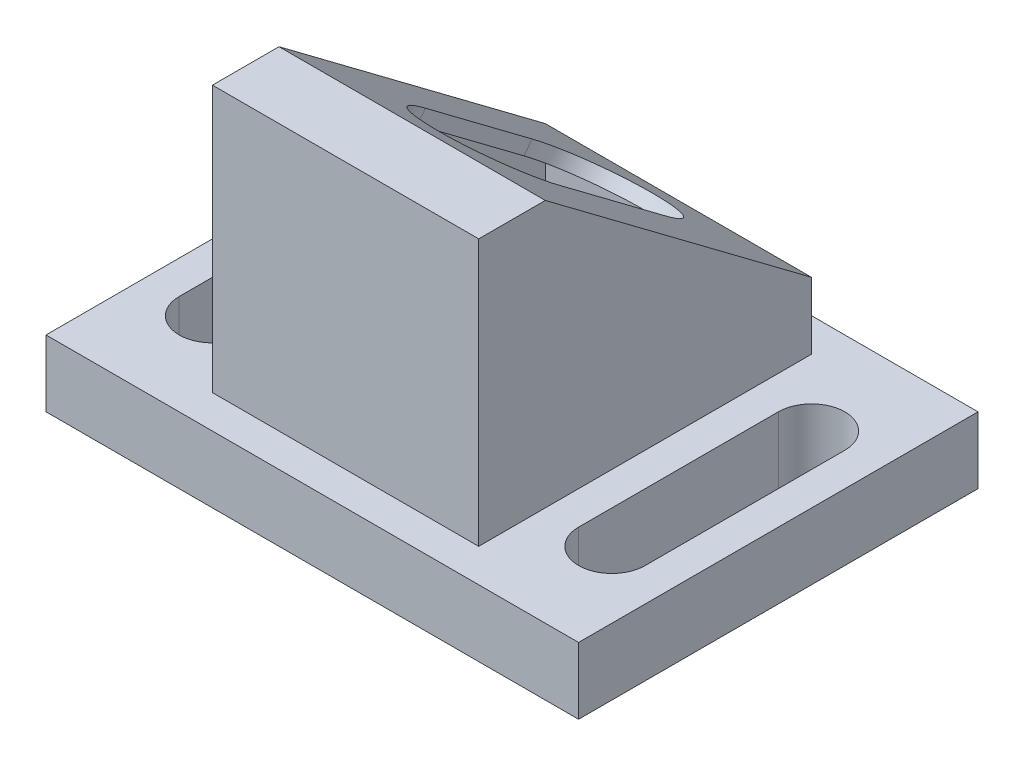
ISO-10303-21;
HEADER;
FILE_DESCRIPTION(('STEP AP214'),'2;1');
FILE_NAME('part.step','',(''),(''),'','','');
FILE_SCHEMA(('AUTOMOTIVE_DESIGN { 1 0 10303 214 1 1 1 1 }'));
ENDSEC;
DATA;
#1=APPLICATION_CONTEXT('core data for automotive mechanical design processes');
#2=APPLICATION_PROTOCOL_DEFINITION('international standard','automotive_design',2000,#1);
#3=PRODUCT_CONTEXT('',#1,'mechanical');
#4=PRODUCT('Part','Part','',(#3));
#5=PRODUCT_RELATED_PRODUCT_CATEGORY('part','',(#4));
#6=PRODUCT_DEFINITION_FORMATION('','',#4);
#7=PRODUCT_DEFINITION_CONTEXT('part definition',#1,'design');
#8=PRODUCT_DEFINITION('design','',#6,#7);
#9=PRODUCT_DEFINITION_SHAPE('','',#8);
#10=(LENGTH_UNIT() NAMED_UNIT(*) SI_UNIT(.MILLI.,.METRE.));
#11=(NAMED_UNIT(*) PLANE_ANGLE_UNIT() SI_UNIT($,.RADIAN.));
#12=(NAMED_UNIT(*) SI_UNIT($,.STERADIAN.) SOLID_ANGLE_UNIT());
#13=UNCERTAINTY_MEASURE_WITH_UNIT(LENGTH_MEASURE(1.E-05),#10,'distance_accuracy_value','');
#14=(GEOMETRIC_REPRESENTATION_CONTEXT(3) GLOBAL_UNCERTAINTY_ASSIGNED_CONTEXT((#13)) GLOBAL_UNIT_ASSIGNED_CONTEXT((#10,
#11,#12)) REPRESENTATION_CONTEXT('',''));
#15=CARTESIAN_POINT('',(0.,0.,0.));
#16=DIRECTION('',(0.,0.,1.));
#17=DIRECTION('',(1.,0.,0.));
#18=AXIS2_PLACEMENT_3D('',#15,#16,#17);
#19=CARTESIAN_POINT('',(0.,12.7,0.));
#20=DIRECTION('',(1.,0.,0.));
#21=DIRECTION('',(0.,0.,-1.));
#22=AXIS2_PLACEMENT_3D('',#19,#20,#21);
#23=PLANE('',#22);
#24=DIRECTION('',(0.,0.,1.));
#25=VECTOR('',#24,1.);
#26=CARTESIAN_POINT('',(0.,0.,0.));
#27=LINE('',#26,#25);
#28=CARTESIAN_POINT('',(0.,0.,0.));
#29=VERTEX_POINT('',#28);
#30=CARTESIAN_POINT('',(0.,0.,76.2));
#31=VERTEX_POINT('',#30);
#32=EDGE_CURVE('E348',#29,#31,#27,.T.);
#33=ORIENTED_EDGE('',*,*,#32,.T.);
#34=DIRECTION('',(0.,-1.,0.));
#35=VECTOR('',#34,1.);
#36=CARTESIAN_POINT('',(0.,12.7,76.2));
#37=LINE('',#36,#35);
#38=CARTESIAN_POINT('',(0.,12.7,76.2));
#39=VERTEX_POINT('',#38);
#40=EDGE_CURVE('E45',#39,#31,#37,.T.);
#41=ORIENTED_EDGE('',*,*,#40,.F.);
#42=DIRECTION('',(0.,0.,1.));
#43=VECTOR('',#42,1.);
#44=CARTESIAN_POINT('',(0.,12.7,0.));
#45=LINE('',#44,#43);
#46=CARTESIAN_POINT('',(0.,12.7,0.));
#47=VERTEX_POINT('',#46);
#48=EDGE_CURVE('E385',#47,#39,#45,.T.);
#49=ORIENTED_EDGE('',*,*,#48,.F.);
#50=DIRECTION('',(0.,-1.,0.));
#51=VECTOR('',#50,1.);
#52=CARTESIAN_POINT('',(0.,12.7,0.));
#53=LINE('',#52,#51);
#54=EDGE_CURVE('E395',#47,#29,#53,.T.);
#55=ORIENTED_EDGE('',*,*,#54,.T.);
#56=EDGE_LOOP('',(#33,#41,#49,#55));
#57=FACE_BOUND('',#56,.T.);
#58=ADVANCED_FACE('F38',(#57),#23,.F.);
#59=CARTESIAN_POINT('',(0.,12.7,76.2));
#60=DIRECTION('',(0.,0.,-1.));
#61=DIRECTION('',(-1.,0.,0.));
#62=AXIS2_PLACEMENT_3D('',#59,#60,#61);
#63=PLANE('',#62);
#64=DIRECTION('',(1.,0.,0.));
#65=VECTOR('',#64,1.);
#66=CARTESIAN_POINT('',(0.,0.,76.2));
#67=LINE('',#66,#65);
#68=CARTESIAN_POINT('',(101.6,0.,76.2));
#69=VERTEX_POINT('',#68);
#70=EDGE_CURVE('E398',#31,#69,#67,.T.);
#71=ORIENTED_EDGE('',*,*,#70,.T.);
#72=DIRECTION('',(0.,-1.,0.));
#73=VECTOR('',#72,1.);
#74=CARTESIAN_POINT('',(101.6,12.7,76.2));
#75=LINE('',#74,#73);
#76=CARTESIAN_POINT('',(101.6,12.7,76.2));
#77=VERTEX_POINT('',#76);
#78=EDGE_CURVE('E408',#77,#69,#75,.T.);
#79=ORIENTED_EDGE('',*,*,#78,.F.);
#80=DIRECTION('',(1.,0.,0.));
#81=VECTOR('',#80,1.);
#82=CARTESIAN_POINT('',(0.,12.7,76.2));
#83=LINE('',#82,#81);
#84=EDGE_CURVE('E388',#39,#77,#83,.T.);
#85=ORIENTED_EDGE('',*,*,#84,.F.);
#86=ORIENTED_EDGE('',*,*,#40,.T.);
#87=EDGE_LOOP('',(#71,#79,#85,#86));
#88=FACE_BOUND('',#87,.T.);
#89=ADVANCED_FACE('F413',(#88),#63,.F.);
#90=CARTESIAN_POINT('',(101.6,12.7,0.));
#91=DIRECTION('',(-1.,0.,0.));
#92=DIRECTION('',(0.,0.,1.));
#93=AXIS2_PLACEMENT_3D('',#90,#91,#92);
#94=PLANE('',#93);
#95=DIRECTION('',(0.,0.,-1.));
#96=VECTOR('',#95,1.);
#97=CARTESIAN_POINT('',(101.6,0.,0.));
#98=LINE('',#97,#96);
#99=CARTESIAN_POINT('',(101.6,0.,0.));
#100=VERTEX_POINT('',#99);
#101=EDGE_CURVE('E400',#69,#100,#98,.T.);
#102=ORIENTED_EDGE('',*,*,#101,.T.);
#103=DIRECTION('',(0.,-1.,0.));
#104=VECTOR('',#103,1.);
#105=CARTESIAN_POINT('',(101.6,12.7,0.));
#106=LINE('',#105,#104);
#107=CARTESIAN_POINT('',(101.6,12.7,0.));
#108=VERTEX_POINT('',#107);
#109=EDGE_CURVE('E405',#108,#100,#106,.T.);
#110=ORIENTED_EDGE('',*,*,#109,.F.);
#111=DIRECTION('',(0.,0.,-1.));
#112=VECTOR('',#111,1.);
#113=CARTESIAN_POINT('',(101.6,12.7,0.));
#114=LINE('',#113,#112);
#115=EDGE_CURVE('E391',#77,#108,#114,.T.);
#116=ORIENTED_EDGE('',*,*,#115,.F.);
#117=ORIENTED_EDGE('',*,*,#78,.T.);
#118=EDGE_LOOP('',(#102,#110,#116,#117));
#119=FACE_BOUND('',#118,.T.);
#120=ADVANCED_FACE('F425',(#119),#94,.F.);
#121=CARTESIAN_POINT('',(0.,12.7,0.));
#122=DIRECTION('',(0.,0.,1.));
#123=DIRECTION('',(1.,0.,0.));
#124=AXIS2_PLACEMENT_3D('',#121,#122,#123);
#125=PLANE('',#124);
#126=DIRECTION('',(-1.,0.,0.));
#127=VECTOR('',#126,1.);
#128=CARTESIAN_POINT('',(0.,0.,0.));
#129=LINE('',#128,#127);
#130=EDGE_CURVE('E389',#100,#29,#129,.T.);
#131=ORIENTED_EDGE('',*,*,#130,.T.);
#132=ORIENTED_EDGE('',*,*,#54,.F.);
#133=DIRECTION('',(-1.,0.,0.));
#134=VECTOR('',#133,1.);
#135=CARTESIAN_POINT('',(0.,12.7,0.));
#136=LINE('',#135,#134);
#137=EDGE_CURVE('E393',#108,#47,#136,.T.);
#138=ORIENTED_EDGE('',*,*,#137,.F.);
#139=ORIENTED_EDGE('',*,*,#109,.T.);
#140=EDGE_LOOP('',(#131,#132,#138,#139));
#141=FACE_BOUND('',#140,.T.);
#142=ADVANCED_FACE('F429',(#141),#125,.F.);
#143=CARTESIAN_POINT('',(0.,12.7,0.));
#144=DIRECTION('',(0.,1.,0.));
#145=DIRECTION('',(0.,0.,1.));
#146=AXIS2_PLACEMENT_3D('',#143,#144,#145);
#147=PLANE('',#146);
#148=DIRECTION('',(0.,0.,-1.));
#149=VECTOR('',#148,1.);
#150=CARTESIAN_POINT('',(76.2,12.7,69.85));
#151=LINE('',#150,#149);
#152=CARTESIAN_POINT('',(76.2,12.7,69.85));
#153=VERTEX_POINT('',#152);
#154=CARTESIAN_POINT('',(76.2,12.7,6.35));
#155=VERTEX_POINT('',#154);
#156=EDGE_CURVE('E285',#153,#155,#151,.T.);
#157=ORIENTED_EDGE('',*,*,#156,.F.);
#158=DIRECTION('',(-1.,0.,0.));
#159=VECTOR('',#158,1.);
#160=CARTESIAN_POINT('',(76.2,12.7,69.85));
#161=LINE('',#160,#159);
#162=CARTESIAN_POINT('',(25.4,12.7,69.85));
#163=VERTEX_POINT('',#162);
#164=EDGE_CURVE('E297',#153,#163,#161,.T.);
#165=ORIENTED_EDGE('',*,*,#164,.T.);
#166=DIRECTION('',(0.,0.,-1.));
#167=VECTOR('',#166,1.);
#168=CARTESIAN_POINT('',(25.4,12.7,69.85));
#169=LINE('',#168,#167);
#170=CARTESIAN_POINT('',(25.4,12.7,6.35));
#171=VERTEX_POINT('',#170);
#172=EDGE_CURVE('E279',#163,#171,#169,.T.);
#173=ORIENTED_EDGE('',*,*,#172,.T.);
#174=DIRECTION('',(-1.,0.,0.));
#175=VECTOR('',#174,1.);
#176=CARTESIAN_POINT('',(76.2,12.7,6.35));
#177=LINE('',#176,#175);
#178=EDGE_CURVE('E318',#155,#171,#177,.T.);
#179=ORIENTED_EDGE('',*,*,#178,.F.);
#180=EDGE_LOOP('',(#157,#165,#173,#179));
#181=FACE_BOUND('',#180,.T.);
#182=CARTESIAN_POINT('',(12.7,12.7,19.05));
#183=DIRECTION('',(0.,1.,0.));
#184=DIRECTION('',(0.,0.,1.));
#185=AXIS2_PLACEMENT_3D('',#182,#183,#184);
#186=CIRCLE('',#185,6.35);
#187=CARTESIAN_POINT('',(19.05,12.7,19.05));
#188=VERTEX_POINT('',#187);
#189=CARTESIAN_POINT('',(6.35000000000002,12.7,19.05));
#190=VERTEX_POINT('',#189);
#191=EDGE_CURVE('E335',#188,#190,#186,.T.);
#192=ORIENTED_EDGE('',*,*,#191,.F.);
#193=DIRECTION('',(0.,0.,-1.));
#194=VECTOR('',#193,1.);
#195=CARTESIAN_POINT('',(19.05,12.7,19.05));
#196=LINE('',#195,#194);
#197=CARTESIAN_POINT('',(19.05,12.7,57.15));
#198=VERTEX_POINT('',#197);
#199=EDGE_CURVE('E325',#198,#188,#196,.T.);
#200=ORIENTED_EDGE('',*,*,#199,.F.);
#201=CARTESIAN_POINT('',(12.7,12.7,57.15));
#202=DIRECTION('',(0.,1.,0.));
#203=DIRECTION('',(0.,0.,1.));
#204=AXIS2_PLACEMENT_3D('',#201,#202,#203);
#205=CIRCLE('',#204,6.35);
#206=CARTESIAN_POINT('',(6.35000000000003,12.7,57.15));
#207=VERTEX_POINT('',#206);
#208=EDGE_CURVE('E341',#207,#198,#205,.T.);
#209=ORIENTED_EDGE('',*,*,#208,.F.);
#210=DIRECTION('',(0.,0.,1.));
#211=VECTOR('',#210,1.);
#212=CARTESIAN_POINT('',(6.35000000000002,12.7,19.05));
#213=LINE('',#212,#211);
#214=EDGE_CURVE('E337',#190,#207,#213,.T.);
#215=ORIENTED_EDGE('',*,*,#214,.F.);
#216=EDGE_LOOP('',(#192,#200,#209,#215));
#217=FACE_BOUND('',#216,.T.);
#218=CARTESIAN_POINT('',(88.9,12.7,19.05));
#219=DIRECTION('',(0.,1.,0.));
#220=DIRECTION('',(0.,0.,1.));
#221=AXIS2_PLACEMENT_3D('',#218,#219,#220);
#222=CIRCLE('',#221,6.35000000000001);
#223=CARTESIAN_POINT('',(95.25,12.7,19.05));
#224=VERTEX_POINT('',#223);
#225=CARTESIAN_POINT('',(82.55,12.7,19.05));
#226=VERTEX_POINT('',#225);
#227=EDGE_CURVE('E320',#224,#226,#222,.T.);
#228=ORIENTED_EDGE('',*,*,#227,.F.);
#229=DIRECTION('',(0.,0.,-1.));
#230=VECTOR('',#229,1.);
#231=CARTESIAN_POINT('',(95.25,12.7,19.05));
#232=LINE('',#231,#230);
#233=CARTESIAN_POINT('',(95.25,12.7,57.15));
#234=VERTEX_POINT('',#233);
#235=EDGE_CURVE('E359',#234,#224,#232,.T.);
#236=ORIENTED_EDGE('',*,*,#235,.F.);
#237=CARTESIAN_POINT('',(88.9,12.7,57.15));
#238=DIRECTION('',(0.,1.,0.));
#239=DIRECTION('',(0.,0.,1.));
#240=AXIS2_PLACEMENT_3D('',#237,#238,#239);
#241=CIRCLE('',#240,6.34999999999999);
#242=CARTESIAN_POINT('',(82.55,12.7,57.15));
#243=VERTEX_POINT('',#242);
#244=EDGE_CURVE('E373',#243,#234,#241,.T.);
#245=ORIENTED_EDGE('',*,*,#244,.F.);
#246=DIRECTION('',(0.,0.,1.));
#247=VECTOR('',#246,1.);
#248=CARTESIAN_POINT('',(82.55,12.7,19.05));
#249=LINE('',#248,#247);
#250=EDGE_CURVE('E370',#226,#243,#249,.T.);
#251=ORIENTED_EDGE('',*,*,#250,.F.);
#252=EDGE_LOOP('',(#228,#236,#245,#251));
#253=FACE_BOUND('',#252,.T.);
#254=ORIENTED_EDGE('',*,*,#48,.T.);
#255=ORIENTED_EDGE('',*,*,#84,.T.);
#256=ORIENTED_EDGE('',*,*,#115,.T.);
#257=ORIENTED_EDGE('',*,*,#137,.T.);
#258=EDGE_LOOP('',(#254,#255,#256,#257));
#259=FACE_BOUND('',#258,.T.);
#260=ADVANCED_FACE('F431',(#181,#217,#253,#259),#147,.T.);
#261=CARTESIAN_POINT('',(0.,0.,0.));
#262=DIRECTION('',(0.,1.,0.));
#263=DIRECTION('',(0.,0.,1.));
#264=AXIS2_PLACEMENT_3D('',#261,#262,#263);
#265=PLANE('',#264);
#266=DIRECTION('',(0.,0.,-1.));
#267=VECTOR('',#266,1.);
#268=CARTESIAN_POINT('',(19.05,0.,19.05));
#269=LINE('',#268,#267);
#270=CARTESIAN_POINT('',(19.05,0.,57.15));
#271=VERTEX_POINT('',#270);
#272=CARTESIAN_POINT('',(19.05,0.,19.05));
#273=VERTEX_POINT('',#272);
#274=EDGE_CURVE('E331',#271,#273,#269,.T.);
#275=ORIENTED_EDGE('',*,*,#274,.T.);
#276=CARTESIAN_POINT('',(12.7,0.,19.05));
#277=DIRECTION('',(0.,1.,0.));
#278=DIRECTION('',(0.,0.,1.));
#279=AXIS2_PLACEMENT_3D('',#276,#277,#278);
#280=CIRCLE('',#279,6.35);
#281=CARTESIAN_POINT('',(6.35000000000002,0.,19.05));
#282=VERTEX_POINT('',#281);
#283=EDGE_CURVE('E321',#273,#282,#280,.T.);
#284=ORIENTED_EDGE('',*,*,#283,.T.);
#285=DIRECTION('',(0.,0.,1.));
#286=VECTOR('',#285,1.);
#287=CARTESIAN_POINT('',(6.35000000000002,0.,19.05));
#288=LINE('',#287,#286);
#289=CARTESIAN_POINT('',(6.35000000000003,0.,57.15));
#290=VERTEX_POINT('',#289);
#291=EDGE_CURVE('E324',#282,#290,#288,.T.);
#292=ORIENTED_EDGE('',*,*,#291,.T.);
#293=CARTESIAN_POINT('',(12.7,0.,57.15));
#294=DIRECTION('',(0.,1.,0.));
#295=DIRECTION('',(0.,0.,1.));
#296=AXIS2_PLACEMENT_3D('',#293,#294,#295);
#297=CIRCLE('',#296,6.35);
#298=EDGE_CURVE('E328',#290,#271,#297,.T.);
#299=ORIENTED_EDGE('',*,*,#298,.T.);
#300=EDGE_LOOP('',(#275,#284,#292,#299));
#301=FACE_BOUND('',#300,.T.);
#302=DIRECTION('',(0.,0.,-1.));
#303=VECTOR('',#302,1.);
#304=CARTESIAN_POINT('',(95.25,0.,19.05));
#305=LINE('',#304,#303);
#306=CARTESIAN_POINT('',(95.25,0.,57.15));
#307=VERTEX_POINT('',#306);
#308=CARTESIAN_POINT('',(95.25,0.,19.05));
#309=VERTEX_POINT('',#308);
#310=EDGE_CURVE('E365',#307,#309,#305,.T.);
#311=ORIENTED_EDGE('',*,*,#310,.T.);
#312=CARTESIAN_POINT('',(88.9,0.,19.05));
#313=DIRECTION('',(0.,1.,0.));
#314=DIRECTION('',(0.,0.,1.));
#315=AXIS2_PLACEMENT_3D('',#312,#313,#314);
#316=CIRCLE('',#315,6.35000000000001);
#317=CARTESIAN_POINT('',(82.55,0.,19.05));
#318=VERTEX_POINT('',#317);
#319=EDGE_CURVE('E355',#309,#318,#316,.T.);
#320=ORIENTED_EDGE('',*,*,#319,.T.);
#321=DIRECTION('',(0.,0.,1.));
#322=VECTOR('',#321,1.);
#323=CARTESIAN_POINT('',(82.55,0.,19.05));
#324=LINE('',#323,#322);
#325=CARTESIAN_POINT('',(82.55,0.,57.15));
#326=VERTEX_POINT('',#325);
#327=EDGE_CURVE('E358',#318,#326,#324,.T.);
#328=ORIENTED_EDGE('',*,*,#327,.T.);
#329=CARTESIAN_POINT('',(88.9,0.,57.15));
#330=DIRECTION('',(0.,1.,0.));
#331=DIRECTION('',(0.,0.,1.));
#332=AXIS2_PLACEMENT_3D('',#329,#330,#331);
#333=CIRCLE('',#332,6.34999999999999);
#334=EDGE_CURVE('E362',#326,#307,#333,.T.);
#335=ORIENTED_EDGE('',*,*,#334,.T.);
#336=EDGE_LOOP('',(#311,#320,#328,#335));
#337=FACE_BOUND('',#336,.T.);
#338=ORIENTED_EDGE('',*,*,#32,.F.);
#339=ORIENTED_EDGE('',*,*,#130,.F.);
#340=ORIENTED_EDGE('',*,*,#101,.F.);
#341=ORIENTED_EDGE('',*,*,#70,.F.);
#342=EDGE_LOOP('',(#338,#339,#340,#341));
#343=FACE_BOUND('',#342,.T.);
#344=ADVANCED_FACE('F421',(#301,#337,#343),#265,.F.);
#345=CARTESIAN_POINT('',(88.9,0.,19.05));
#346=DIRECTION('',(0.,1.,0.));
#347=DIRECTION('',(0.,0.,1.));
#348=AXIS2_PLACEMENT_3D('',#345,#346,#347);
#349=CYLINDRICAL_SURFACE('',#348,6.35000000000001);
#350=ORIENTED_EDGE('',*,*,#227,.T.);
#351=DIRECTION('',(0.,1.,0.));
#352=VECTOR('',#351,1.);
#353=CARTESIAN_POINT('',(82.55,0.,19.05));
#354=LINE('',#353,#352);
#355=EDGE_CURVE('E368',#318,#226,#354,.T.);
#356=ORIENTED_EDGE('',*,*,#355,.F.);
#357=ORIENTED_EDGE('',*,*,#319,.F.);
#358=DIRECTION('',(0.,1.,0.));
#359=VECTOR('',#358,1.);
#360=CARTESIAN_POINT('',(95.25,0.,19.05));
#361=LINE('',#360,#359);
#362=EDGE_CURVE('E338',#309,#224,#361,.T.);
#363=ORIENTED_EDGE('',*,*,#362,.T.);
#364=EDGE_LOOP('',(#350,#356,#357,#363));
#365=FACE_BOUND('',#364,.T.);
#366=ADVANCED_FACE('F439',(#365),#349,.F.);
#367=CARTESIAN_POINT('',(95.25,0.,19.05));
#368=DIRECTION('',(1.,0.,0.));
#369=DIRECTION('',(0.,0.,-1.));
#370=AXIS2_PLACEMENT_3D('',#367,#368,#369);
#371=PLANE('',#370);
#372=ORIENTED_EDGE('',*,*,#235,.T.);
#373=ORIENTED_EDGE('',*,*,#362,.F.);
#374=ORIENTED_EDGE('',*,*,#310,.F.);
#375=DIRECTION('',(0.,1.,0.));
#376=VECTOR('',#375,1.);
#377=CARTESIAN_POINT('',(95.25,0.,57.15));
#378=LINE('',#377,#376);
#379=EDGE_CURVE('E379',#307,#234,#378,.T.);
#380=ORIENTED_EDGE('',*,*,#379,.T.);
#381=EDGE_LOOP('',(#372,#373,#374,#380));
#382=FACE_BOUND('',#381,.T.);
#383=ADVANCED_FACE('F476',(#382),#371,.F.);
#384=CARTESIAN_POINT('',(88.9,0.,57.15));
#385=DIRECTION('',(0.,1.,0.));
#386=DIRECTION('',(0.,0.,1.));
#387=AXIS2_PLACEMENT_3D('',#384,#385,#386);
#388=CYLINDRICAL_SURFACE('',#387,6.34999999999999);
#389=ORIENTED_EDGE('',*,*,#244,.T.);
#390=ORIENTED_EDGE('',*,*,#379,.F.);
#391=ORIENTED_EDGE('',*,*,#334,.F.);
#392=DIRECTION('',(0.,1.,0.));
#393=VECTOR('',#392,1.);
#394=CARTESIAN_POINT('',(82.55,0.,57.15));
#395=LINE('',#394,#393);
#396=EDGE_CURVE('E381',#326,#243,#395,.T.);
#397=ORIENTED_EDGE('',*,*,#396,.T.);
#398=EDGE_LOOP('',(#389,#390,#391,#397));
#399=FACE_BOUND('',#398,.T.);
#400=ADVANCED_FACE('F485',(#399),#388,.F.);
#401=CARTESIAN_POINT('',(82.55,0.,19.05));
#402=DIRECTION('',(-1.,0.,0.));
#403=DIRECTION('',(0.,0.,1.));
#404=AXIS2_PLACEMENT_3D('',#401,#402,#403);
#405=PLANE('',#404);
#406=ORIENTED_EDGE('',*,*,#250,.T.);
#407=ORIENTED_EDGE('',*,*,#396,.F.);
#408=ORIENTED_EDGE('',*,*,#327,.F.);
#409=ORIENTED_EDGE('',*,*,#355,.T.);
#410=EDGE_LOOP('',(#406,#407,#408,#409));
#411=FACE_BOUND('',#410,.T.);
#412=ADVANCED_FACE('F495',(#411),#405,.F.);
#413=CARTESIAN_POINT('',(12.7,0.,19.05));
#414=DIRECTION('',(0.,1.,0.));
#415=DIRECTION('',(0.,0.,1.));
#416=AXIS2_PLACEMENT_3D('',#413,#414,#415);
#417=CYLINDRICAL_SURFACE('',#416,6.35);
#418=ORIENTED_EDGE('',*,*,#191,.T.);
#419=DIRECTION('',(0.,1.,0.));
#420=VECTOR('',#419,1.);
#421=CARTESIAN_POINT('',(6.35000000000002,0.,19.05));
#422=LINE('',#421,#420);
#423=EDGE_CURVE('E334',#282,#190,#422,.T.);
#424=ORIENTED_EDGE('',*,*,#423,.F.);
#425=ORIENTED_EDGE('',*,*,#283,.F.);
#426=DIRECTION('',(0.,1.,0.));
#427=VECTOR('',#426,1.);
#428=CARTESIAN_POINT('',(19.05,0.,19.05));
#429=LINE('',#428,#427);
#430=EDGE_CURVE('E346',#273,#188,#429,.T.);
#431=ORIENTED_EDGE('',*,*,#430,.T.);
#432=EDGE_LOOP('',(#418,#424,#425,#431));
#433=FACE_BOUND('',#432,.T.);
#434=ADVANCED_FACE('F505',(#433),#417,.F.);
#435=CARTESIAN_POINT('',(19.05,0.,19.05));
#436=DIRECTION('',(1.,0.,0.));
#437=DIRECTION('',(0.,0.,-1.));
#438=AXIS2_PLACEMENT_3D('',#435,#436,#437);
#439=PLANE('',#438);
#440=ORIENTED_EDGE('',*,*,#199,.T.);
#441=ORIENTED_EDGE('',*,*,#430,.F.);
#442=ORIENTED_EDGE('',*,*,#274,.F.);
#443=DIRECTION('',(0.,1.,0.));
#444=VECTOR('',#443,1.);
#445=CARTESIAN_POINT('',(19.05,0.,57.15));
#446=LINE('',#445,#444);
#447=EDGE_CURVE('E349',#271,#198,#446,.T.);
#448=ORIENTED_EDGE('',*,*,#447,.T.);
#449=EDGE_LOOP('',(#440,#441,#442,#448));
#450=FACE_BOUND('',#449,.T.);
#451=ADVANCED_FACE('F515',(#450),#439,.F.);
#452=CARTESIAN_POINT('',(12.7,0.,57.15));
#453=DIRECTION('',(0.,1.,0.));
#454=DIRECTION('',(0.,0.,1.));
#455=AXIS2_PLACEMENT_3D('',#452,#453,#454);
#456=CYLINDRICAL_SURFACE('',#455,6.35);
#457=ORIENTED_EDGE('',*,*,#208,.T.);
#458=ORIENTED_EDGE('',*,*,#447,.F.);
#459=ORIENTED_EDGE('',*,*,#298,.F.);
#460=DIRECTION('',(0.,1.,0.));
#461=VECTOR('',#460,1.);
#462=CARTESIAN_POINT('',(6.35000000000003,0.,57.15));
#463=LINE('',#462,#461);
#464=EDGE_CURVE('E351',#290,#207,#463,.T.);
#465=ORIENTED_EDGE('',*,*,#464,.T.);
#466=EDGE_LOOP('',(#457,#458,#459,#465));
#467=FACE_BOUND('',#466,.T.);
#468=ADVANCED_FACE('F525',(#467),#456,.F.);
#469=CARTESIAN_POINT('',(6.35000000000002,0.,19.05));
#470=DIRECTION('',(-1.,0.,0.));
#471=DIRECTION('',(0.,0.,1.));
#472=AXIS2_PLACEMENT_3D('',#469,#470,#471);
#473=PLANE('',#472);
#474=ORIENTED_EDGE('',*,*,#214,.T.);
#475=ORIENTED_EDGE('',*,*,#464,.F.);
#476=ORIENTED_EDGE('',*,*,#291,.F.);
#477=ORIENTED_EDGE('',*,*,#423,.T.);
#478=EDGE_LOOP('',(#474,#475,#476,#477));
#479=FACE_BOUND('',#478,.T.);
#480=ADVANCED_FACE('F535',(#479),#473,.F.);
#481=CARTESIAN_POINT('',(76.2,12.7,6.35));
#482=DIRECTION('',(0.,0.,1.));
#483=DIRECTION('',(1.,0.,0.));
#484=AXIS2_PLACEMENT_3D('',#481,#482,#483);
#485=PLANE('',#484);
#486=DIRECTION('',(0.,1.,0.));
#487=VECTOR('',#486,1.);
#488=CARTESIAN_POINT('',(25.4,12.7,6.35));
#489=LINE('',#488,#487);
#490=CARTESIAN_POINT('',(25.4,25.4,6.35));
#491=VERTEX_POINT('',#490);
#492=EDGE_CURVE('E300',#171,#491,#489,.T.);
#493=ORIENTED_EDGE('',*,*,#492,.T.);
#494=DIRECTION('',(-1.,0.,0.));
#495=VECTOR('',#494,1.);
#496=CARTESIAN_POINT('',(76.2,25.4,6.35));
#497=LINE('',#496,#495);
#498=CARTESIAN_POINT('',(76.2,25.4,6.35));
#499=VERTEX_POINT('',#498);
#500=EDGE_CURVE('E315',#499,#491,#497,.T.);
#501=ORIENTED_EDGE('',*,*,#500,.F.);
#502=DIRECTION('',(0.,1.,0.));
#503=VECTOR('',#502,1.);
#504=CARTESIAN_POINT('',(76.2,12.7,6.35));
#505=LINE('',#504,#503);
#506=EDGE_CURVE('E288',#155,#499,#505,.T.);
#507=ORIENTED_EDGE('',*,*,#506,.F.);
#508=ORIENTED_EDGE('',*,*,#178,.T.);
#509=EDGE_LOOP('',(#493,#501,#507,#508));
#510=FACE_BOUND('',#509,.T.);
#511=ADVANCED_FACE('F544',(#510),#485,.F.);
#512=CARTESIAN_POINT('',(76.2,63.5,57.15));
#513=DIRECTION('',(0.,-0.8,0.6));
#514=DIRECTION('',(0.,-0.6,-0.8));
#515=AXIS2_PLACEMENT_3D('',#512,#513,#514);
#516=PLANE('',#515);
#517=DIRECTION('',(0.,0.6,0.8));
#518=VECTOR('',#517,1.);
#519=CARTESIAN_POINT('',(38.1,36.83,21.59));
#520=LINE('',#519,#518);
#521=CARTESIAN_POINT('',(38.1,36.83,21.59));
#522=VERTEX_POINT('',#521);
#523=CARTESIAN_POINT('',(38.1,52.07,41.91));
#524=VERTEX_POINT('',#523);
#525=EDGE_CURVE('E269',#522,#524,#520,.T.);
#526=ORIENTED_EDGE('',*,*,#525,.F.);
#527=CARTESIAN_POINT('',(50.8,36.83,21.59));
#528=DIRECTION('',(0.,0.8,-0.6));
#529=DIRECTION('',(0.,0.6,0.8));
#530=AXIS2_PLACEMENT_3D('',#527,#528,#529);
#531=CIRCLE('',#530,12.7);
#532=CARTESIAN_POINT('',(63.5,36.83,21.59));
#533=VERTEX_POINT('',#532);
#534=EDGE_CURVE('E267',#533,#522,#531,.T.);
#535=ORIENTED_EDGE('',*,*,#534,.F.);
#536=DIRECTION('',(0.,-0.6,-0.8));
#537=VECTOR('',#536,1.);
#538=CARTESIAN_POINT('',(63.5,36.83,21.59));
#539=LINE('',#538,#537);
#540=CARTESIAN_POINT('',(63.5,52.07,41.91));
#541=VERTEX_POINT('',#540);
#542=EDGE_CURVE('E274',#541,#533,#539,.T.);
#543=ORIENTED_EDGE('',*,*,#542,.F.);
#544=CARTESIAN_POINT('',(50.8,52.07,41.91));
#545=DIRECTION('',(0.,0.8,-0.6));
#546=DIRECTION('',(0.,0.6,0.8));
#547=AXIS2_PLACEMENT_3D('',#544,#545,#546);
#548=CIRCLE('',#547,12.7);
#549=EDGE_CURVE('E271',#524,#541,#548,.T.);
#550=ORIENTED_EDGE('',*,*,#549,.F.);
#551=EDGE_LOOP('',(#526,#535,#543,#550));
#552=FACE_BOUND('',#551,.T.);
#553=DIRECTION('',(0.,0.6,0.8));
#554=VECTOR('',#553,1.);
#555=CARTESIAN_POINT('',(25.4,63.5,57.15));
#556=LINE('',#555,#554);
#557=CARTESIAN_POINT('',(25.4,63.5,57.15));
#558=VERTEX_POINT('',#557);
#559=EDGE_CURVE('E302',#491,#558,#556,.T.);
#560=ORIENTED_EDGE('',*,*,#559,.T.);
#561=DIRECTION('',(-1.,0.,0.));
#562=VECTOR('',#561,1.);
#563=CARTESIAN_POINT('',(76.2,63.5,57.15));
#564=LINE('',#563,#562);
#565=CARTESIAN_POINT('',(76.2,63.5,57.15));
#566=VERTEX_POINT('',#565);
#567=EDGE_CURVE('E312',#566,#558,#564,.T.);
#568=ORIENTED_EDGE('',*,*,#567,.F.);
#569=DIRECTION('',(0.,0.6,0.8));
#570=VECTOR('',#569,1.);
#571=CARTESIAN_POINT('',(76.2,63.5,57.15));
#572=LINE('',#571,#570);
#573=EDGE_CURVE('E291',#499,#566,#572,.T.);
#574=ORIENTED_EDGE('',*,*,#573,.F.);
#575=ORIENTED_EDGE('',*,*,#500,.T.);
#576=EDGE_LOOP('',(#560,#568,#574,#575));
#577=FACE_BOUND('',#576,.T.);
#578=ADVANCED_FACE('F558',(#552,#577),#516,.F.);
#579=CARTESIAN_POINT('',(76.2,63.5,69.85));
#580=DIRECTION('',(0.,-1.,0.));
#581=DIRECTION('',(0.,0.,-1.));
#582=AXIS2_PLACEMENT_3D('',#579,#580,#581);
#583=PLANE('',#582);
#584=DIRECTION('',(0.,0.,1.));
#585=VECTOR('',#584,1.);
#586=CARTESIAN_POINT('',(25.4,63.5,69.85));
#587=LINE('',#586,#585);
#588=CARTESIAN_POINT('',(25.4,63.5,69.85));
#589=VERTEX_POINT('',#588);
#590=EDGE_CURVE('E304',#558,#589,#587,.T.);
#591=ORIENTED_EDGE('',*,*,#590,.T.);
#592=DIRECTION('',(-1.,0.,0.));
#593=VECTOR('',#592,1.);
#594=CARTESIAN_POINT('',(76.2,63.5,69.85));
#595=LINE('',#594,#593);
#596=CARTESIAN_POINT('',(76.2,63.5,69.85));
#597=VERTEX_POINT('',#596);
#598=EDGE_CURVE('E309',#597,#589,#595,.T.);
#599=ORIENTED_EDGE('',*,*,#598,.F.);
#600=DIRECTION('',(0.,0.,1.));
#601=VECTOR('',#600,1.);
#602=CARTESIAN_POINT('',(76.2,63.5,69.85));
#603=LINE('',#602,#601);
#604=EDGE_CURVE('E293',#566,#597,#603,.T.);
#605=ORIENTED_EDGE('',*,*,#604,.F.);
#606=ORIENTED_EDGE('',*,*,#567,.T.);
#607=EDGE_LOOP('',(#591,#599,#605,#606));
#608=FACE_BOUND('',#607,.T.);
#609=ADVANCED_FACE('F566',(#608),#583,.F.);
#610=CARTESIAN_POINT('',(76.2,12.7,69.85));
#611=DIRECTION('',(0.,0.,-1.));
#612=DIRECTION('',(-1.,0.,0.));
#613=AXIS2_PLACEMENT_3D('',#610,#611,#612);
#614=PLANE('',#613);
#615=DIRECTION('',(0.,-1.,0.));
#616=VECTOR('',#615,1.);
#617=CARTESIAN_POINT('',(25.4,12.7,69.85));
#618=LINE('',#617,#616);
#619=EDGE_CURVE('E289',#589,#163,#618,.T.);
#620=ORIENTED_EDGE('',*,*,#619,.T.);
#621=ORIENTED_EDGE('',*,*,#164,.F.);
#622=DIRECTION('',(0.,-1.,0.));
#623=VECTOR('',#622,1.);
#624=CARTESIAN_POINT('',(76.2,12.7,69.85));
#625=LINE('',#624,#623);
#626=EDGE_CURVE('E295',#597,#153,#625,.T.);
#627=ORIENTED_EDGE('',*,*,#626,.F.);
#628=ORIENTED_EDGE('',*,*,#598,.T.);
#629=EDGE_LOOP('',(#620,#621,#627,#628));
#630=FACE_BOUND('',#629,.T.);
#631=ADVANCED_FACE('F571',(#630),#614,.F.);
#632=CARTESIAN_POINT('',(76.2,0.,0.));
#633=DIRECTION('',(1.,0.,0.));
#634=DIRECTION('',(0.,0.,-1.));
#635=AXIS2_PLACEMENT_3D('',#632,#633,#634);
#636=PLANE('',#635);
#637=ORIENTED_EDGE('',*,*,#156,.T.);
#638=ORIENTED_EDGE('',*,*,#506,.T.);
#639=ORIENTED_EDGE('',*,*,#573,.T.);
#640=ORIENTED_EDGE('',*,*,#604,.T.);
#641=ORIENTED_EDGE('',*,*,#626,.T.);
#642=EDGE_LOOP('',(#637,#638,#639,#640,#641));
#643=FACE_BOUND('',#642,.T.);
#644=ADVANCED_FACE('F581',(#643),#636,.T.);
#645=CARTESIAN_POINT('',(25.4,0.,0.));
#646=DIRECTION('',(1.,0.,0.));
#647=DIRECTION('',(0.,0.,-1.));
#648=AXIS2_PLACEMENT_3D('',#645,#646,#647);
#649=PLANE('',#648);
#650=ORIENTED_EDGE('',*,*,#172,.F.);
#651=ORIENTED_EDGE('',*,*,#619,.F.);
#652=ORIENTED_EDGE('',*,*,#590,.F.);
#653=ORIENTED_EDGE('',*,*,#559,.F.);
#654=ORIENTED_EDGE('',*,*,#492,.F.);
#655=EDGE_LOOP('',(#650,#651,#652,#653,#654));
#656=FACE_BOUND('',#655,.T.);
#657=ADVANCED_FACE('F591',(#656),#649,.F.);
#658=CARTESIAN_POINT('',(50.8,26.67,29.21));
#659=DIRECTION('',(0.,0.8,-0.6));
#660=DIRECTION('',(0.,0.6,0.8));
#661=AXIS2_PLACEMENT_3D('',#658,#659,#660);
#662=CYLINDRICAL_SURFACE('',#661,12.7);
#663=DIRECTION('',(0.,0.8,-0.6));
#664=VECTOR('',#663,1.);
#665=CARTESIAN_POINT('',(38.1,26.67,29.21));
#666=LINE('',#665,#664);
#667=CARTESIAN_POINT('',(38.1,34.798,23.114));
#668=VERTEX_POINT('',#667);
#669=EDGE_CURVE('E58',#668,#522,#666,.T.);
#670=ORIENTED_EDGE('',*,*,#669,.F.);
#671=CARTESIAN_POINT('',(50.8,34.798,23.114));
#672=DIRECTION('',(0.,0.8,-0.6));
#673=DIRECTION('',(0.,0.6,0.8));
#674=AXIS2_PLACEMENT_3D('',#671,#672,#673);
#675=CIRCLE('',#674,12.7);
#676=CARTESIAN_POINT('',(63.5,34.798,23.114));
#677=VERTEX_POINT('',#676);
#678=EDGE_CURVE('E52',#668,#677,#675,.F.);
#679=ORIENTED_EDGE('',*,*,#678,.T.);
#680=DIRECTION('',(0.,0.8,-0.6));
#681=VECTOR('',#680,1.);
#682=CARTESIAN_POINT('',(63.5,26.67,29.21));
#683=LINE('',#682,#681);
#684=EDGE_CURVE('E277',#677,#533,#683,.T.);
#685=ORIENTED_EDGE('',*,*,#684,.T.);
#686=ORIENTED_EDGE('',*,*,#534,.T.);
#687=EDGE_LOOP('',(#670,#679,#685,#686));
#688=FACE_BOUND('',#687,.T.);
#689=ADVANCED_FACE('F601',(#688),#662,.F.);
#690=CARTESIAN_POINT('',(63.5,26.67,29.21));
#691=DIRECTION('',(1.,0.,0.));
#692=DIRECTION('',(0.,0.,-1.));
#693=AXIS2_PLACEMENT_3D('',#690,#691,#692);
#694=PLANE('',#693);
#695=ORIENTED_EDGE('',*,*,#684,.F.);
#696=DIRECTION('',(0.,0.6,0.8));
#697=VECTOR('',#696,1.);
#698=CARTESIAN_POINT('',(63.5,34.798,23.114));
#699=LINE('',#698,#697);
#700=CARTESIAN_POINT('',(63.5,50.038,43.434));
#701=VERTEX_POINT('',#700);
#702=EDGE_CURVE('E263',#677,#701,#699,.T.);
#703=ORIENTED_EDGE('',*,*,#702,.T.);
#704=DIRECTION('',(0.,0.8,-0.6));
#705=VECTOR('',#704,1.);
#706=CARTESIAN_POINT('',(63.5,41.91,49.53));
#707=LINE('',#706,#705);
#708=EDGE_CURVE('E280',#701,#541,#707,.T.);
#709=ORIENTED_EDGE('',*,*,#708,.T.);
#710=ORIENTED_EDGE('',*,*,#542,.T.);
#711=EDGE_LOOP('',(#695,#703,#709,#710));
#712=FACE_BOUND('',#711,.T.);
#713=ADVANCED_FACE('F618',(#712),#694,.F.);
#714=CARTESIAN_POINT('',(50.8,41.91,49.53));
#715=DIRECTION('',(0.,0.8,-0.6));
#716=DIRECTION('',(0.,0.6,0.8));
#717=AXIS2_PLACEMENT_3D('',#714,#715,#716);
#718=CYLINDRICAL_SURFACE('',#717,12.7);
#719=ORIENTED_EDGE('',*,*,#708,.F.);
#720=CARTESIAN_POINT('',(50.8,50.038,43.434));
#721=DIRECTION('',(0.,0.8,-0.6));
#722=DIRECTION('',(0.,0.6,0.8));
#723=AXIS2_PLACEMENT_3D('',#720,#721,#722);
#724=CIRCLE('',#723,12.7);
#725=CARTESIAN_POINT('',(38.1,50.038,43.434));
#726=VERTEX_POINT('',#725);
#727=EDGE_CURVE('E255',#701,#726,#724,.F.);
#728=ORIENTED_EDGE('',*,*,#727,.T.);
#729=DIRECTION('',(0.,0.8,-0.6));
#730=VECTOR('',#729,1.);
#731=CARTESIAN_POINT('',(38.1,41.91,49.53));
#732=LINE('',#731,#730);
#733=EDGE_CURVE('E282',#726,#524,#732,.T.);
#734=ORIENTED_EDGE('',*,*,#733,.T.);
#735=ORIENTED_EDGE('',*,*,#549,.T.);
#736=EDGE_LOOP('',(#719,#728,#734,#735));
#737=FACE_BOUND('',#736,.T.);
#738=ADVANCED_FACE('F628',(#737),#718,.F.);
#739=CARTESIAN_POINT('',(38.1,26.67,29.21));
#740=DIRECTION('',(-1.,0.,0.));
#741=DIRECTION('',(0.,0.,1.));
#742=AXIS2_PLACEMENT_3D('',#739,#740,#741);
#743=PLANE('',#742);
#744=ORIENTED_EDGE('',*,*,#733,.F.);
#745=DIRECTION('',(0.,-0.6,-0.8));
#746=VECTOR('',#745,1.);
#747=CARTESIAN_POINT('',(38.1,34.798,23.114));
#748=LINE('',#747,#746);
#749=EDGE_CURVE('E11',#726,#668,#748,.T.);
#750=ORIENTED_EDGE('',*,*,#749,.T.);
#751=ORIENTED_EDGE('',*,*,#669,.T.);
#752=ORIENTED_EDGE('',*,*,#525,.T.);
#753=EDGE_LOOP('',(#744,#750,#751,#752));
#754=FACE_BOUND('',#753,.T.);
#755=ADVANCED_FACE('F638',(#754),#743,.F.);
#756=CARTESIAN_POINT('',(29.21,25.0825,10.16));
#757=DIRECTION('',(0.,0.8,-0.6));
#758=DIRECTION('',(0.,0.6,0.8));
#759=AXIS2_PLACEMENT_3D('',#756,#757,#758);
#760=PLANE('',#759);
#761=DIRECTION('',(0.,0.6,0.8));
#762=VECTOR('',#761,1.);
#763=CARTESIAN_POINT('',(72.39,25.0825,10.16));
#764=LINE('',#763,#762);
#765=CARTESIAN_POINT('',(72.39,25.0825,10.16));
#766=VERTEX_POINT('',#765);
#767=CARTESIAN_POINT('',(72.39,59.69,56.3033333333333));
#768=VERTEX_POINT('',#767);
#769=EDGE_CURVE('E235',#766,#768,#764,.T.);
#770=ORIENTED_EDGE('',*,*,#769,.T.);
#771=DIRECTION('',(1.,0.,0.));
#772=VECTOR('',#771,1.);
#773=CARTESIAN_POINT('',(29.21,59.69,56.3033333333333));
#774=LINE('',#773,#772);
#775=CARTESIAN_POINT('',(29.21,59.69,56.3033333333333));
#776=VERTEX_POINT('',#775);
#777=EDGE_CURVE('E253',#776,#768,#774,.T.);
#778=ORIENTED_EDGE('',*,*,#777,.F.);
#779=DIRECTION('',(0.,0.6,0.8));
#780=VECTOR('',#779,1.);
#781=CARTESIAN_POINT('',(29.21,25.0825,10.16));
#782=LINE('',#781,#780);
#783=CARTESIAN_POINT('',(29.21,25.0825,10.16));
#784=VERTEX_POINT('',#783);
#785=EDGE_CURVE('E222',#784,#776,#782,.T.);
#786=ORIENTED_EDGE('',*,*,#785,.F.);
#787=DIRECTION('',(1.,0.,0.));
#788=VECTOR('',#787,1.);
#789=CARTESIAN_POINT('',(29.21,25.0825,10.16));
#790=LINE('',#789,#788);
#791=EDGE_CURVE('E256',#784,#766,#790,.T.);
#792=ORIENTED_EDGE('',*,*,#791,.T.);
#793=EDGE_LOOP('',(#770,#778,#786,#792));
#794=FACE_BOUND('',#793,.T.);
#795=ORIENTED_EDGE('',*,*,#749,.F.);
#796=ORIENTED_EDGE('',*,*,#727,.F.);
#797=ORIENTED_EDGE('',*,*,#702,.F.);
#798=ORIENTED_EDGE('',*,*,#678,.F.);
#799=EDGE_LOOP('',(#795,#796,#797,#798));
#800=FACE_BOUND('',#799,.T.);
#801=ADVANCED_FACE('F648',(#794,#800),#760,.F.);
#802=CARTESIAN_POINT('',(29.21,59.69,56.3033333333333));
#803=DIRECTION('',(0.,1.,0.));
#804=DIRECTION('',(0.,0.,1.));
#805=AXIS2_PLACEMENT_3D('',#802,#803,#804);
#806=PLANE('',#805);
#807=DIRECTION('',(0.,0.,1.));
#808=VECTOR('',#807,1.);
#809=CARTESIAN_POINT('',(72.39,59.69,56.3033333333333));
#810=LINE('',#809,#808);
#811=CARTESIAN_POINT('',(72.39,59.69,69.596));
#812=VERTEX_POINT('',#811);
#813=EDGE_CURVE('E217',#768,#812,#810,.T.);
#814=ORIENTED_EDGE('',*,*,#813,.T.);
#815=DIRECTION('',(1.,0.,0.));
#816=VECTOR('',#815,1.);
#817=CARTESIAN_POINT('',(29.21,59.69,69.596));
#818=LINE('',#817,#816);
#819=CARTESIAN_POINT('',(29.21,59.69,69.596));
#820=VERTEX_POINT('',#819);
#821=EDGE_CURVE('E210',#820,#812,#818,.T.);
#822=ORIENTED_EDGE('',*,*,#821,.F.);
#823=DIRECTION('',(0.,0.,1.));
#824=VECTOR('',#823,1.);
#825=CARTESIAN_POINT('',(29.21,59.69,56.3033333333333));
#826=LINE('',#825,#824);
#827=EDGE_CURVE('E214',#776,#820,#826,.T.);
#828=ORIENTED_EDGE('',*,*,#827,.F.);
#829=ORIENTED_EDGE('',*,*,#777,.T.);
#830=EDGE_LOOP('',(#814,#822,#828,#829));
#831=FACE_BOUND('',#830,.T.);
#832=ADVANCED_FACE('F212',(#831),#806,.F.);
#833=CARTESIAN_POINT('',(29.21,12.7,10.16));
#834=DIRECTION('',(0.,0.,-1.));
#835=DIRECTION('',(-1.,0.,0.));
#836=AXIS2_PLACEMENT_3D('',#833,#834,#835);
#837=PLANE('',#836);
#838=DIRECTION('',(0.,1.,0.));
#839=VECTOR('',#838,1.);
#840=CARTESIAN_POINT('',(72.39,12.7,10.16));
#841=LINE('',#840,#839);
#842=CARTESIAN_POINT('',(72.39,12.7,10.16));
#843=VERTEX_POINT('',#842);
#844=EDGE_CURVE('E238',#843,#766,#841,.T.);
#845=ORIENTED_EDGE('',*,*,#844,.T.);
#846=ORIENTED_EDGE('',*,*,#791,.F.);
#847=DIRECTION('',(0.,1.,0.));
#848=VECTOR('',#847,1.);
#849=CARTESIAN_POINT('',(29.21,12.7,10.16));
#850=LINE('',#849,#848);
#851=CARTESIAN_POINT('',(29.21,12.7,10.16));
#852=VERTEX_POINT('',#851);
#853=EDGE_CURVE('E242',#852,#784,#850,.T.);
#854=ORIENTED_EDGE('',*,*,#853,.F.);
#855=DIRECTION('',(1.,0.,0.));
#856=VECTOR('',#855,1.);
#857=CARTESIAN_POINT('',(29.21,12.7,10.16));
#858=LINE('',#857,#856);
#859=EDGE_CURVE('E258',#852,#843,#858,.T.);
#860=ORIENTED_EDGE('',*,*,#859,.T.);
#861=EDGE_LOOP('',(#845,#846,#854,#860));
#862=FACE_BOUND('',#861,.T.);
#863=ADVANCED_FACE('F666',(#862),#837,.F.);
#864=CARTESIAN_POINT('',(29.21,12.7,69.596));
#865=DIRECTION('',(0.,-1.,0.));
#866=DIRECTION('',(0.,0.,-1.));
#867=AXIS2_PLACEMENT_3D('',#864,#865,#866);
#868=PLANE('',#867);
#869=DIRECTION('',(0.,0.,-1.));
#870=VECTOR('',#869,1.);
#871=CARTESIAN_POINT('',(72.39,12.7,69.596));
#872=LINE('',#871,#870);
#873=CARTESIAN_POINT('',(72.39,12.7,69.596));
#874=VERTEX_POINT('',#873);
#875=EDGE_CURVE('E248',#874,#843,#872,.T.);
#876=ORIENTED_EDGE('',*,*,#875,.T.);
#877=ORIENTED_EDGE('',*,*,#859,.F.);
#878=DIRECTION('',(0.,0.,-1.));
#879=VECTOR('',#878,1.);
#880=CARTESIAN_POINT('',(29.21,12.7,69.596));
#881=LINE('',#880,#879);
#882=CARTESIAN_POINT('',(29.21,12.7,69.596));
#883=VERTEX_POINT('',#882);
#884=EDGE_CURVE('E230',#883,#852,#881,.T.);
#885=ORIENTED_EDGE('',*,*,#884,.F.);
#886=DIRECTION('',(1.,0.,0.));
#887=VECTOR('',#886,1.);
#888=CARTESIAN_POINT('',(29.21,12.7,69.596));
#889=LINE('',#888,#887);
#890=EDGE_CURVE('E221',#883,#874,#889,.T.);
#891=ORIENTED_EDGE('',*,*,#890,.T.);
#892=EDGE_LOOP('',(#876,#877,#885,#891));
#893=FACE_BOUND('',#892,.T.);
#894=ADVANCED_FACE('F675',(#893),#868,.F.);
#895=CARTESIAN_POINT('',(29.21,59.69,69.596));
#896=DIRECTION('',(0.,0.,1.));
#897=DIRECTION('',(1.,0.,0.));
#898=AXIS2_PLACEMENT_3D('',#895,#896,#897);
#899=PLANE('',#898);
#900=DIRECTION('',(0.,-1.,0.));
#901=VECTOR('',#900,1.);
#902=CARTESIAN_POINT('',(72.39,59.69,69.596));
#903=LINE('',#902,#901);
#904=EDGE_CURVE('E246',#812,#874,#903,.T.);
#905=ORIENTED_EDGE('',*,*,#904,.T.);
#906=ORIENTED_EDGE('',*,*,#890,.F.);
#907=DIRECTION('',(0.,-1.,0.));
#908=VECTOR('',#907,1.);
#909=CARTESIAN_POINT('',(29.21,59.69,69.596));
#910=LINE('',#909,#908);
#911=EDGE_CURVE('E225',#820,#883,#910,.T.);
#912=ORIENTED_EDGE('',*,*,#911,.F.);
#913=ORIENTED_EDGE('',*,*,#821,.T.);
#914=EDGE_LOOP('',(#905,#906,#912,#913));
#915=FACE_BOUND('',#914,.T.);
#916=ADVANCED_FACE('F226',(#915),#899,.F.);
#917=CARTESIAN_POINT('',(29.21,0.,0.));
#918=DIRECTION('',(1.,0.,0.));
#919=DIRECTION('',(0.,0.,-1.));
#920=AXIS2_PLACEMENT_3D('',#917,#918,#919);
#921=PLANE('',#920);
#922=ORIENTED_EDGE('',*,*,#827,.T.);
#923=ORIENTED_EDGE('',*,*,#911,.T.);
#924=ORIENTED_EDGE('',*,*,#884,.T.);
#925=ORIENTED_EDGE('',*,*,#853,.T.);
#926=ORIENTED_EDGE('',*,*,#785,.T.);
#927=EDGE_LOOP('',(#922,#923,#924,#925,#926));
#928=FACE_BOUND('',#927,.T.);
#929=ADVANCED_FACE('F232',(#928),#921,.T.);
#930=CARTESIAN_POINT('',(72.39,0.,0.));
#931=DIRECTION('',(1.,0.,0.));
#932=DIRECTION('',(0.,0.,-1.));
#933=AXIS2_PLACEMENT_3D('',#930,#931,#932);
#934=PLANE('',#933);
#935=ORIENTED_EDGE('',*,*,#813,.F.);
#936=ORIENTED_EDGE('',*,*,#769,.F.);
#937=ORIENTED_EDGE('',*,*,#844,.F.);
#938=ORIENTED_EDGE('',*,*,#875,.F.);
#939=ORIENTED_EDGE('',*,*,#904,.F.);
#940=EDGE_LOOP('',(#935,#936,#937,#938,#939));
#941=FACE_BOUND('',#940,.T.);
#942=ADVANCED_FACE('F702',(#941),#934,.F.);
#943=CLOSED_SHELL('',(#58,#89,#120,#142,#260,#344,#366,#383,#400,#412,#434,#451,#468,#480,#511,
#578,#609,#631,#644,#657,#689,#713,#738,#755,#801,#832,#863,#894,#916,#929,#942));
#944=MANIFOLD_SOLID_BREP('B2',#943);
#945=ADVANCED_BREP_SHAPE_REPRESENTATION('',(#18,#944),#14);
#946=SHAPE_DEFINITION_REPRESENTATION(#9,#945);
ENDSEC;
END-ISO-10303-21;
